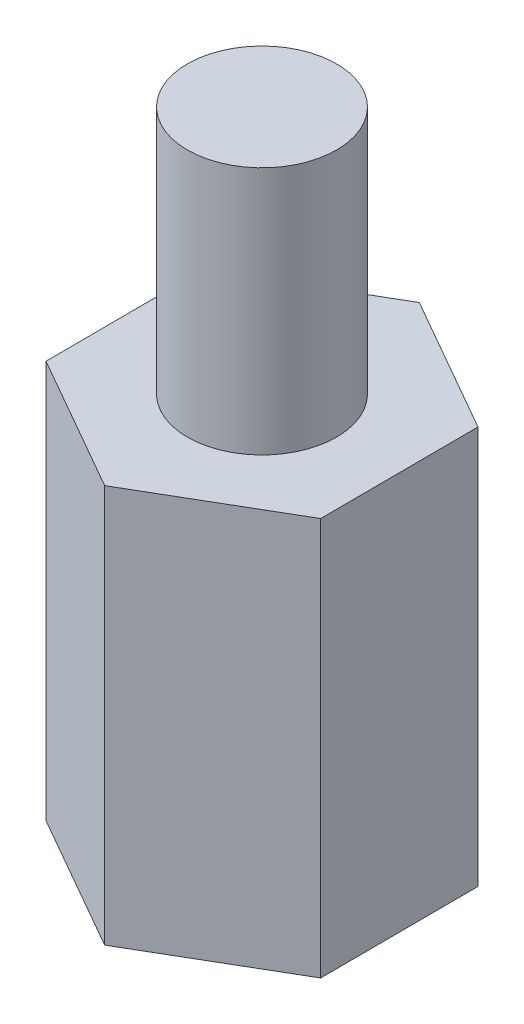
ISO-10303-21;
HEADER;
FILE_DESCRIPTION(('STEP AP214'),'2;1');
FILE_NAME('part.step','',(''),(''),'','','');
FILE_SCHEMA(('AUTOMOTIVE_DESIGN { 1 0 10303 214 1 1 1 1 }'));
ENDSEC;
DATA;
#1=APPLICATION_CONTEXT('core data for automotive mechanical design processes');
#2=APPLICATION_PROTOCOL_DEFINITION('international standard','automotive_design',2000,#1);
#3=PRODUCT_CONTEXT('',#1,'mechanical');
#4=PRODUCT('Part','Part','',(#3));
#5=PRODUCT_RELATED_PRODUCT_CATEGORY('part','',(#4));
#6=PRODUCT_DEFINITION_FORMATION('','',#4);
#7=PRODUCT_DEFINITION_CONTEXT('part definition',#1,'design');
#8=PRODUCT_DEFINITION('design','',#6,#7);
#9=PRODUCT_DEFINITION_SHAPE('','',#8);
#10=(LENGTH_UNIT() NAMED_UNIT(*) SI_UNIT(.MILLI.,.METRE.));
#11=(NAMED_UNIT(*) PLANE_ANGLE_UNIT() SI_UNIT($,.RADIAN.));
#12=(NAMED_UNIT(*) SI_UNIT($,.STERADIAN.) SOLID_ANGLE_UNIT());
#13=UNCERTAINTY_MEASURE_WITH_UNIT(LENGTH_MEASURE(1.E-05),#10,'distance_accuracy_value','');
#14=(GEOMETRIC_REPRESENTATION_CONTEXT(3) GLOBAL_UNCERTAINTY_ASSIGNED_CONTEXT((#13)) GLOBAL_UNIT_ASSIGNED_CONTEXT((#10,
#11,#12)) REPRESENTATION_CONTEXT('',''));
#15=CARTESIAN_POINT('',(0.,0.,0.));
#16=DIRECTION('',(0.,0.,1.));
#17=DIRECTION('',(1.,0.,0.));
#18=AXIS2_PLACEMENT_3D('',#15,#16,#17);
#19=CARTESIAN_POINT('',(2.75647725298331,8.,1.57644108266656));
#20=DIRECTION('',(-0.9999916190243,0.,0.00409412764320857));
#21=DIRECTION('',(0.00409412764320857,0.,0.9999916190243));
#22=AXIS2_PLACEMENT_3D('',#19,#20,#21);
#23=PLANE('',#22);
#24=DIRECTION('',(-0.00409412764320857,0.,-0.9999916190243));
#25=VECTOR('',#24,1.);
#26=CARTESIAN_POINT('',(2.75647725298331,0.,1.57644108266656));
#27=LINE('',#26,#25);
#28=CARTESIAN_POINT('',(2.75647725298331,0.,1.57644108266656));
#29=VERTEX_POINT('',#28);
#30=CARTESIAN_POINT('',(2.74347665165034,0.,-1.59895878470421));
#31=VERTEX_POINT('',#30);
#32=EDGE_CURVE('E120',#29,#31,#27,.T.);
#33=ORIENTED_EDGE('',*,*,#32,.T.);
#34=DIRECTION('',(0.,-1.,0.));
#35=VECTOR('',#34,1.);
#36=CARTESIAN_POINT('',(2.74347665165034,8.,-1.59895878470421));
#37=LINE('',#36,#35);
#38=CARTESIAN_POINT('',(2.74347665165034,8.,-1.59895878470421));
#39=VERTEX_POINT('',#38);
#40=EDGE_CURVE('E37',#39,#31,#37,.T.);
#41=ORIENTED_EDGE('',*,*,#40,.F.);
#42=DIRECTION('',(-0.00409412764320857,0.,-0.9999916190243));
#43=VECTOR('',#42,1.);
#44=CARTESIAN_POINT('',(2.75647725298331,8.,1.57644108266656));
#45=LINE('',#44,#43);
#46=CARTESIAN_POINT('',(2.75647725298331,8.,1.57644108266656));
#47=VERTEX_POINT('',#46);
#48=EDGE_CURVE('E131',#47,#39,#45,.T.);
#49=ORIENTED_EDGE('',*,*,#48,.F.);
#50=DIRECTION('',(0.,-1.,0.));
#51=VECTOR('',#50,1.);
#52=CARTESIAN_POINT('',(2.75647725298331,8.,1.57644108266656));
#53=LINE('',#52,#51);
#54=EDGE_CURVE('E116',#47,#29,#53,.T.);
#55=ORIENTED_EDGE('',*,*,#54,.T.);
#56=EDGE_LOOP('',(#33,#41,#49,#55));
#57=FACE_BOUND('',#56,.T.);
#58=ADVANCED_FACE('F34',(#57),#23,.F.);
#59=CARTESIAN_POINT('',(2.74347665165034,8.,-1.59895878470421));
#60=DIRECTION('',(-0.496450190966796,0.,0.868065209468178));
#61=DIRECTION('',(0.868065209468178,0.,0.496450190966796));
#62=AXIS2_PLACEMENT_3D('',#59,#60,#61);
#63=PLANE('',#62);
#64=DIRECTION('',(-0.868065209468178,0.,-0.496450190966796));
#65=VECTOR('',#64,1.);
#66=CARTESIAN_POINT('',(2.74347665165034,0.,-1.59895878470421));
#67=LINE('',#66,#65);
#68=CARTESIAN_POINT('',(-0.0130006013329671,0.,-3.17539986737077));
#69=VERTEX_POINT('',#68);
#70=EDGE_CURVE('E123',#31,#69,#67,.T.);
#71=ORIENTED_EDGE('',*,*,#70,.T.);
#72=DIRECTION('',(0.,-1.,0.));
#73=VECTOR('',#72,1.);
#74=CARTESIAN_POINT('',(-0.0130006013329671,8.,-3.17539986737077));
#75=LINE('',#74,#73);
#76=CARTESIAN_POINT('',(-0.0130006013329671,8.,-3.17539986737077));
#77=VERTEX_POINT('',#76);
#78=EDGE_CURVE('E134',#77,#69,#75,.T.);
#79=ORIENTED_EDGE('',*,*,#78,.F.);
#80=DIRECTION('',(-0.868065209468178,0.,-0.496450190966796));
#81=VECTOR('',#80,1.);
#82=CARTESIAN_POINT('',(2.74347665165034,8.,-1.59895878470421));
#83=LINE('',#82,#81);
#84=EDGE_CURVE('E89',#39,#77,#83,.T.);
#85=ORIENTED_EDGE('',*,*,#84,.F.);
#86=ORIENTED_EDGE('',*,*,#40,.T.);
#87=EDGE_LOOP('',(#71,#79,#85,#86));
#88=FACE_BOUND('',#87,.T.);
#89=ADVANCED_FACE('F139',(#88),#63,.F.);
#90=CARTESIAN_POINT('',(-0.0130006013329671,8.,-3.17539986737077));
#91=DIRECTION('',(0.503541428057505,0.,0.86397108182497));
#92=DIRECTION('',(0.86397108182497,0.,-0.503541428057505));
#93=AXIS2_PLACEMENT_3D('',#90,#91,#92);
#94=PLANE('',#93);
#95=DIRECTION('',(-0.86397108182497,0.,0.503541428057505));
#96=VECTOR('',#95,1.);
#97=CARTESIAN_POINT('',(-0.0130006013329671,0.,-3.17539986737077));
#98=LINE('',#97,#96);
#99=CARTESIAN_POINT('',(-2.75647725298331,0.,-1.57644108266656));
#100=VERTEX_POINT('',#99);
#101=EDGE_CURVE('E126',#69,#100,#98,.T.);
#102=ORIENTED_EDGE('',*,*,#101,.T.);
#103=DIRECTION('',(0.,-1.,0.));
#104=VECTOR('',#103,1.);
#105=CARTESIAN_POINT('',(-2.75647725298331,8.,-1.57644108266656));
#106=LINE('',#105,#104);
#107=CARTESIAN_POINT('',(-2.75647725298331,8.,-1.57644108266656));
#108=VERTEX_POINT('',#107);
#109=EDGE_CURVE('E111',#108,#100,#106,.T.);
#110=ORIENTED_EDGE('',*,*,#109,.F.);
#111=DIRECTION('',(-0.86397108182497,0.,0.503541428057505));
#112=VECTOR('',#111,1.);
#113=CARTESIAN_POINT('',(-0.0130006013329671,8.,-3.17539986737077));
#114=LINE('',#113,#112);
#115=EDGE_CURVE('E102',#77,#108,#114,.T.);
#116=ORIENTED_EDGE('',*,*,#115,.F.);
#117=ORIENTED_EDGE('',*,*,#78,.T.);
#118=EDGE_LOOP('',(#102,#110,#116,#117));
#119=FACE_BOUND('',#118,.T.);
#120=ADVANCED_FACE('F145',(#119),#94,.F.);
#121=CARTESIAN_POINT('',(-2.75647725298331,8.,-1.57644108266656));
#122=DIRECTION('',(0.9999916190243,0.,-0.00409412764320857));
#123=DIRECTION('',(-0.00409412764320857,0.,-0.9999916190243));
#124=AXIS2_PLACEMENT_3D('',#121,#122,#123);
#125=PLANE('',#124);
#126=DIRECTION('',(0.00409412764320857,0.,0.9999916190243));
#127=VECTOR('',#126,1.);
#128=CARTESIAN_POINT('',(-2.75647725298331,0.,-1.57644108266656));
#129=LINE('',#128,#127);
#130=CARTESIAN_POINT('',(-2.74347665165034,0.,1.59895878470421));
#131=VERTEX_POINT('',#130);
#132=EDGE_CURVE('E110',#100,#131,#129,.T.);
#133=ORIENTED_EDGE('',*,*,#132,.T.);
#134=DIRECTION('',(0.,-1.,0.));
#135=VECTOR('',#134,1.);
#136=CARTESIAN_POINT('',(-2.74347665165034,8.,1.59895878470421));
#137=LINE('',#136,#135);
#138=CARTESIAN_POINT('',(-2.74347665165034,8.,1.59895878470421));
#139=VERTEX_POINT('',#138);
#140=EDGE_CURVE('E107',#139,#131,#137,.T.);
#141=ORIENTED_EDGE('',*,*,#140,.F.);
#142=DIRECTION('',(0.00409412764320857,0.,0.9999916190243));
#143=VECTOR('',#142,1.);
#144=CARTESIAN_POINT('',(-2.75647725298331,8.,-1.57644108266656));
#145=LINE('',#144,#143);
#146=EDGE_CURVE('E96',#108,#139,#145,.T.);
#147=ORIENTED_EDGE('',*,*,#146,.F.);
#148=ORIENTED_EDGE('',*,*,#109,.T.);
#149=EDGE_LOOP('',(#133,#141,#147,#148));
#150=FACE_BOUND('',#149,.T.);
#151=ADVANCED_FACE('F108',(#150),#125,.F.);
#152=CARTESIAN_POINT('',(-2.74347665165034,8.,1.59895878470421));
#153=DIRECTION('',(0.496450190966795,0.,-0.868065209468179));
#154=DIRECTION('',(-0.868065209468179,0.,-0.496450190966795));
#155=AXIS2_PLACEMENT_3D('',#152,#153,#154);
#156=PLANE('',#155);
#157=DIRECTION('',(0.868065209468179,0.,0.496450190966795));
#158=VECTOR('',#157,1.);
#159=CARTESIAN_POINT('',(-2.74347665165034,0.,1.59895878470421));
#160=LINE('',#159,#158);
#161=CARTESIAN_POINT('',(0.013000601332967,0.,3.17539986737077));
#162=VERTEX_POINT('',#161);
#163=EDGE_CURVE('E74',#131,#162,#160,.T.);
#164=ORIENTED_EDGE('',*,*,#163,.T.);
#165=DIRECTION('',(0.,-1.,0.));
#166=VECTOR('',#165,1.);
#167=CARTESIAN_POINT('',(0.013000601332967,8.,3.17539986737077));
#168=LINE('',#167,#166);
#169=CARTESIAN_POINT('',(0.013000601332967,8.,3.17539986737077));
#170=VERTEX_POINT('',#169);
#171=EDGE_CURVE('E112',#170,#162,#168,.T.);
#172=ORIENTED_EDGE('',*,*,#171,.F.);
#173=DIRECTION('',(0.868065209468179,0.,0.496450190966795));
#174=VECTOR('',#173,1.);
#175=CARTESIAN_POINT('',(-2.74347665165034,8.,1.59895878470421));
#176=LINE('',#175,#174);
#177=EDGE_CURVE('E100',#139,#170,#176,.T.);
#178=ORIENTED_EDGE('',*,*,#177,.F.);
#179=ORIENTED_EDGE('',*,*,#140,.T.);
#180=EDGE_LOOP('',(#164,#172,#178,#179));
#181=FACE_BOUND('',#180,.T.);
#182=ADVANCED_FACE('F114',(#181),#156,.F.);
#183=CARTESIAN_POINT('',(0.013000601332967,8.,3.17539986737077));
#184=DIRECTION('',(-0.503541428057505,0.,-0.86397108182497));
#185=DIRECTION('',(-0.86397108182497,0.,0.503541428057505));
#186=AXIS2_PLACEMENT_3D('',#183,#184,#185);
#187=PLANE('',#186);
#188=DIRECTION('',(0.86397108182497,0.,-0.503541428057505));
#189=VECTOR('',#188,1.);
#190=CARTESIAN_POINT('',(0.013000601332967,0.,3.17539986737077));
#191=LINE('',#190,#189);
#192=EDGE_CURVE('E80',#162,#29,#191,.T.);
#193=ORIENTED_EDGE('',*,*,#192,.T.);
#194=ORIENTED_EDGE('',*,*,#54,.F.);
#195=DIRECTION('',(0.86397108182497,0.,-0.503541428057505));
#196=VECTOR('',#195,1.);
#197=CARTESIAN_POINT('',(0.013000601332967,8.,3.17539986737077));
#198=LINE('',#197,#196);
#199=EDGE_CURVE('E51',#170,#47,#198,.T.);
#200=ORIENTED_EDGE('',*,*,#199,.F.);
#201=ORIENTED_EDGE('',*,*,#171,.T.);
#202=EDGE_LOOP('',(#193,#194,#200,#201));
#203=FACE_BOUND('',#202,.T.);
#204=ADVANCED_FACE('F161',(#203),#187,.F.);
#205=CARTESIAN_POINT('',(0.,8.,0.));
#206=DIRECTION('',(0.,1.,0.));
#207=DIRECTION('',(0.,0.,1.));
#208=AXIS2_PLACEMENT_3D('',#205,#206,#207);
#209=PLANE('',#208);
#210=CARTESIAN_POINT('',(0.,8.,0.));
#211=DIRECTION('',(0.,1.,0.));
#212=DIRECTION('',(0.,0.,1.));
#213=AXIS2_PLACEMENT_3D('',#210,#211,#212);
#214=CIRCLE('',#213,1.5);
#215=CARTESIAN_POINT('',(0.,8.,1.5));
#216=VERTEX_POINT('',#215);
#217=EDGE_CURVE('E11',#216,#216,#214,.T.);
#218=ORIENTED_EDGE('',*,*,#217,.F.);
#219=EDGE_LOOP('',(#218));
#220=FACE_BOUND('',#219,.T.);
#221=ORIENTED_EDGE('',*,*,#48,.T.);
#222=ORIENTED_EDGE('',*,*,#84,.T.);
#223=ORIENTED_EDGE('',*,*,#115,.T.);
#224=ORIENTED_EDGE('',*,*,#146,.T.);
#225=ORIENTED_EDGE('',*,*,#177,.T.);
#226=ORIENTED_EDGE('',*,*,#199,.T.);
#227=EDGE_LOOP('',(#221,#222,#223,#224,#225,#226));
#228=FACE_BOUND('',#227,.T.);
#229=ADVANCED_FACE('F98',(#220,#228),#209,.T.);
#230=CARTESIAN_POINT('',(0.,0.,0.));
#231=DIRECTION('',(0.,1.,0.));
#232=DIRECTION('',(0.,0.,1.));
#233=AXIS2_PLACEMENT_3D('',#230,#231,#232);
#234=PLANE('',#233);
#235=ORIENTED_EDGE('',*,*,#32,.F.);
#236=ORIENTED_EDGE('',*,*,#192,.F.);
#237=ORIENTED_EDGE('',*,*,#163,.F.);
#238=ORIENTED_EDGE('',*,*,#132,.F.);
#239=ORIENTED_EDGE('',*,*,#101,.F.);
#240=ORIENTED_EDGE('',*,*,#70,.F.);
#241=EDGE_LOOP('',(#235,#236,#237,#238,#239,#240));
#242=FACE_BOUND('',#241,.T.);
#243=ADVANCED_FACE('F144',(#242),#234,.F.);
#244=CARTESIAN_POINT('',(0.,13.,0.));
#245=DIRECTION('',(0.,-1.,0.));
#246=DIRECTION('',(0.,0.,-1.));
#247=AXIS2_PLACEMENT_3D('',#244,#245,#246);
#248=CYLINDRICAL_SURFACE('',#247,1.5);
#249=CARTESIAN_POINT('',(0.,13.,0.));
#250=DIRECTION('',(0.,1.,0.));
#251=DIRECTION('',(0.,0.,1.));
#252=AXIS2_PLACEMENT_3D('',#249,#250,#251);
#253=CIRCLE('',#252,1.5);
#254=CARTESIAN_POINT('',(0.,13.,1.5));
#255=VERTEX_POINT('',#254);
#256=EDGE_CURVE('E124',#255,#255,#253,.T.);
#257=ORIENTED_EDGE('',*,*,#256,.F.);
#258=EDGE_LOOP('',(#257));
#259=FACE_BOUND('',#258,.T.);
#260=ORIENTED_EDGE('',*,*,#217,.T.);
#261=EDGE_LOOP('',(#260));
#262=FACE_BOUND('',#261,.T.);
#263=ADVANCED_FACE('F154',(#259,#262),#248,.T.);
#264=CARTESIAN_POINT('',(0.,13.,0.));
#265=DIRECTION('',(0.,1.,0.));
#266=DIRECTION('',(0.,0.,1.));
#267=AXIS2_PLACEMENT_3D('',#264,#265,#266);
#268=PLANE('',#267);
#269=ORIENTED_EDGE('',*,*,#256,.T.);
#270=EDGE_LOOP('',(#269));
#271=FACE_BOUND('',#270,.T.);
#272=ADVANCED_FACE('F152',(#271),#268,.T.);
#273=CLOSED_SHELL('',(#58,#89,#120,#151,#182,#204,#229,#243,#263,#272));
#274=MANIFOLD_SOLID_BREP('B2',#273);
#275=ADVANCED_BREP_SHAPE_REPRESENTATION('',(#18,#274),#14);
#276=SHAPE_DEFINITION_REPRESENTATION(#9,#275);
ENDSEC;
END-ISO-10303-21;
